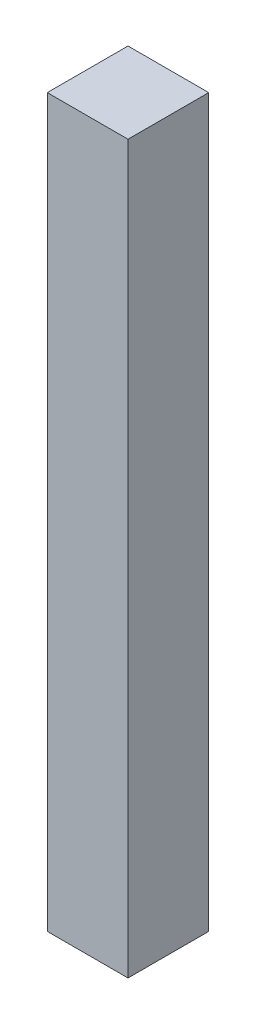
ISO-10303-21;
HEADER;
FILE_DESCRIPTION(('STEP AP214'),'2;1');
FILE_NAME('part.step','',(''),(''),'','','');
FILE_SCHEMA(('AUTOMOTIVE_DESIGN { 1 0 10303 214 1 1 1 1 }'));
ENDSEC;
DATA;
#1=APPLICATION_CONTEXT('core data for automotive mechanical design processes');
#2=APPLICATION_PROTOCOL_DEFINITION('international standard','automotive_design',2000,#1);
#3=PRODUCT_CONTEXT('',#1,'mechanical');
#4=PRODUCT('Part','Part','',(#3));
#5=PRODUCT_RELATED_PRODUCT_CATEGORY('part','',(#4));
#6=PRODUCT_DEFINITION_FORMATION('','',#4);
#7=PRODUCT_DEFINITION_CONTEXT('part definition',#1,'design');
#8=PRODUCT_DEFINITION('design','',#6,#7);
#9=PRODUCT_DEFINITION_SHAPE('','',#8);
#10=(LENGTH_UNIT() NAMED_UNIT(*) SI_UNIT(.MILLI.,.METRE.));
#11=(NAMED_UNIT(*) PLANE_ANGLE_UNIT() SI_UNIT($,.RADIAN.));
#12=(NAMED_UNIT(*) SI_UNIT($,.STERADIAN.) SOLID_ANGLE_UNIT());
#13=UNCERTAINTY_MEASURE_WITH_UNIT(LENGTH_MEASURE(1.E-05),#10,'distance_accuracy_value','');
#14=(GEOMETRIC_REPRESENTATION_CONTEXT(3) GLOBAL_UNCERTAINTY_ASSIGNED_CONTEXT((#13)) GLOBAL_UNIT_ASSIGNED_CONTEXT((#10,
#11,#12)) REPRESENTATION_CONTEXT('',''));
#15=CARTESIAN_POINT('',(0.,0.,0.));
#16=DIRECTION('',(0.,0.,1.));
#17=DIRECTION('',(1.,0.,0.));
#18=AXIS2_PLACEMENT_3D('',#15,#16,#17);
#19=CARTESIAN_POINT('',(0.,270.,0.));
#20=DIRECTION('',(1.,0.,0.));
#21=DIRECTION('',(0.,0.,-1.));
#22=AXIS2_PLACEMENT_3D('',#19,#20,#21);
#23=PLANE('',#22);
#24=DIRECTION('',(0.,0.,1.));
#25=VECTOR('',#24,1.);
#26=CARTESIAN_POINT('',(0.,0.,0.));
#27=LINE('',#26,#25);
#28=CARTESIAN_POINT('',(0.,0.,0.));
#29=VERTEX_POINT('',#28);
#30=CARTESIAN_POINT('',(0.,0.,30.));
#31=VERTEX_POINT('',#30);
#32=EDGE_CURVE('E100',#29,#31,#27,.T.);
#33=ORIENTED_EDGE('',*,*,#32,.T.);
#34=DIRECTION('',(0.,-1.,0.));
#35=VECTOR('',#34,1.);
#36=CARTESIAN_POINT('',(0.,270.,30.));
#37=LINE('',#36,#35);
#38=CARTESIAN_POINT('',(0.,270.,30.));
#39=VERTEX_POINT('',#38);
#40=EDGE_CURVE('E11',#39,#31,#37,.T.);
#41=ORIENTED_EDGE('',*,*,#40,.F.);
#42=DIRECTION('',(0.,0.,1.));
#43=VECTOR('',#42,1.);
#44=CARTESIAN_POINT('',(0.,270.,0.));
#45=LINE('',#44,#43);
#46=CARTESIAN_POINT('',(0.,270.,0.));
#47=VERTEX_POINT('',#46);
#48=EDGE_CURVE('E88',#47,#39,#45,.T.);
#49=ORIENTED_EDGE('',*,*,#48,.F.);
#50=DIRECTION('',(0.,-1.,0.));
#51=VECTOR('',#50,1.);
#52=CARTESIAN_POINT('',(0.,270.,0.));
#53=LINE('',#52,#51);
#54=EDGE_CURVE('E96',#47,#29,#53,.T.);
#55=ORIENTED_EDGE('',*,*,#54,.T.);
#56=EDGE_LOOP('',(#33,#41,#49,#55));
#57=FACE_BOUND('',#56,.T.);
#58=ADVANCED_FACE('F37',(#57),#23,.F.);
#59=CARTESIAN_POINT('',(0.,270.,30.));
#60=DIRECTION('',(0.,0.,-1.));
#61=DIRECTION('',(-1.,0.,0.));
#62=AXIS2_PLACEMENT_3D('',#59,#60,#61);
#63=PLANE('',#62);
#64=DIRECTION('',(1.,0.,0.));
#65=VECTOR('',#64,1.);
#66=CARTESIAN_POINT('',(0.,0.,30.));
#67=LINE('',#66,#65);
#68=CARTESIAN_POINT('',(30.,0.,30.));
#69=VERTEX_POINT('',#68);
#70=EDGE_CURVE('E92',#31,#69,#67,.T.);
#71=ORIENTED_EDGE('',*,*,#70,.T.);
#72=DIRECTION('',(0.,-1.,0.));
#73=VECTOR('',#72,1.);
#74=CARTESIAN_POINT('',(30.,270.,30.));
#75=LINE('',#74,#73);
#76=CARTESIAN_POINT('',(30.,270.,30.));
#77=VERTEX_POINT('',#76);
#78=EDGE_CURVE('E45',#77,#69,#75,.T.);
#79=ORIENTED_EDGE('',*,*,#78,.F.);
#80=DIRECTION('',(1.,0.,0.));
#81=VECTOR('',#80,1.);
#82=CARTESIAN_POINT('',(0.,270.,30.));
#83=LINE('',#82,#81);
#84=EDGE_CURVE('E83',#39,#77,#83,.T.);
#85=ORIENTED_EDGE('',*,*,#84,.F.);
#86=ORIENTED_EDGE('',*,*,#40,.T.);
#87=EDGE_LOOP('',(#71,#79,#85,#86));
#88=FACE_BOUND('',#87,.T.);
#89=ADVANCED_FACE('F91',(#88),#63,.F.);
#90=CARTESIAN_POINT('',(30.,270.,0.));
#91=DIRECTION('',(-1.,0.,0.));
#92=DIRECTION('',(0.,0.,1.));
#93=AXIS2_PLACEMENT_3D('',#90,#91,#92);
#94=PLANE('',#93);
#95=DIRECTION('',(0.,0.,-1.));
#96=VECTOR('',#95,1.);
#97=CARTESIAN_POINT('',(30.,0.,0.));
#98=LINE('',#97,#96);
#99=CARTESIAN_POINT('',(30.,0.,0.));
#100=VERTEX_POINT('',#99);
#101=EDGE_CURVE('E70',#69,#100,#98,.T.);
#102=ORIENTED_EDGE('',*,*,#101,.T.);
#103=DIRECTION('',(0.,-1.,0.));
#104=VECTOR('',#103,1.);
#105=CARTESIAN_POINT('',(30.,270.,0.));
#106=LINE('',#105,#104);
#107=CARTESIAN_POINT('',(30.,270.,0.));
#108=VERTEX_POINT('',#107);
#109=EDGE_CURVE('E93',#108,#100,#106,.T.);
#110=ORIENTED_EDGE('',*,*,#109,.F.);
#111=DIRECTION('',(0.,0.,-1.));
#112=VECTOR('',#111,1.);
#113=CARTESIAN_POINT('',(30.,270.,0.));
#114=LINE('',#113,#112);
#115=EDGE_CURVE('E86',#77,#108,#114,.T.);
#116=ORIENTED_EDGE('',*,*,#115,.F.);
#117=ORIENTED_EDGE('',*,*,#78,.T.);
#118=EDGE_LOOP('',(#102,#110,#116,#117));
#119=FACE_BOUND('',#118,.T.);
#120=ADVANCED_FACE('F94',(#119),#94,.F.);
#121=CARTESIAN_POINT('',(0.,270.,0.));
#122=DIRECTION('',(0.,0.,1.));
#123=DIRECTION('',(1.,0.,0.));
#124=AXIS2_PLACEMENT_3D('',#121,#122,#123);
#125=PLANE('',#124);
#126=DIRECTION('',(-1.,0.,0.));
#127=VECTOR('',#126,1.);
#128=CARTESIAN_POINT('',(0.,0.,0.));
#129=LINE('',#128,#127);
#130=EDGE_CURVE('E76',#100,#29,#129,.T.);
#131=ORIENTED_EDGE('',*,*,#130,.T.);
#132=ORIENTED_EDGE('',*,*,#54,.F.);
#133=DIRECTION('',(-1.,0.,0.));
#134=VECTOR('',#133,1.);
#135=CARTESIAN_POINT('',(0.,270.,0.));
#136=LINE('',#135,#134);
#137=EDGE_CURVE('E53',#108,#47,#136,.T.);
#138=ORIENTED_EDGE('',*,*,#137,.F.);
#139=ORIENTED_EDGE('',*,*,#109,.T.);
#140=EDGE_LOOP('',(#131,#132,#138,#139));
#141=FACE_BOUND('',#140,.T.);
#142=ADVANCED_FACE('F107',(#141),#125,.F.);
#143=CARTESIAN_POINT('',(0.,270.,0.));
#144=DIRECTION('',(0.,1.,0.));
#145=DIRECTION('',(0.,0.,1.));
#146=AXIS2_PLACEMENT_3D('',#143,#144,#145);
#147=PLANE('',#146);
#148=ORIENTED_EDGE('',*,*,#48,.T.);
#149=ORIENTED_EDGE('',*,*,#84,.T.);
#150=ORIENTED_EDGE('',*,*,#115,.T.);
#151=ORIENTED_EDGE('',*,*,#137,.T.);
#152=EDGE_LOOP('',(#148,#149,#150,#151));
#153=FACE_BOUND('',#152,.T.);
#154=ADVANCED_FACE('F84',(#153),#147,.T.);
#155=CARTESIAN_POINT('',(0.,0.,0.));
#156=DIRECTION('',(0.,1.,0.));
#157=DIRECTION('',(0.,0.,1.));
#158=AXIS2_PLACEMENT_3D('',#155,#156,#157);
#159=PLANE('',#158);
#160=ORIENTED_EDGE('',*,*,#32,.F.);
#161=ORIENTED_EDGE('',*,*,#130,.F.);
#162=ORIENTED_EDGE('',*,*,#101,.F.);
#163=ORIENTED_EDGE('',*,*,#70,.F.);
#164=EDGE_LOOP('',(#160,#161,#162,#163));
#165=FACE_BOUND('',#164,.T.);
#166=ADVANCED_FACE('F110',(#165),#159,.F.);
#167=CLOSED_SHELL('',(#58,#89,#120,#142,#154,#166));
#168=MANIFOLD_SOLID_BREP('B2',#167);
#169=ADVANCED_BREP_SHAPE_REPRESENTATION('',(#18,#168),#14);
#170=SHAPE_DEFINITION_REPRESENTATION(#9,#169);
ENDSEC;
END-ISO-10303-21;
